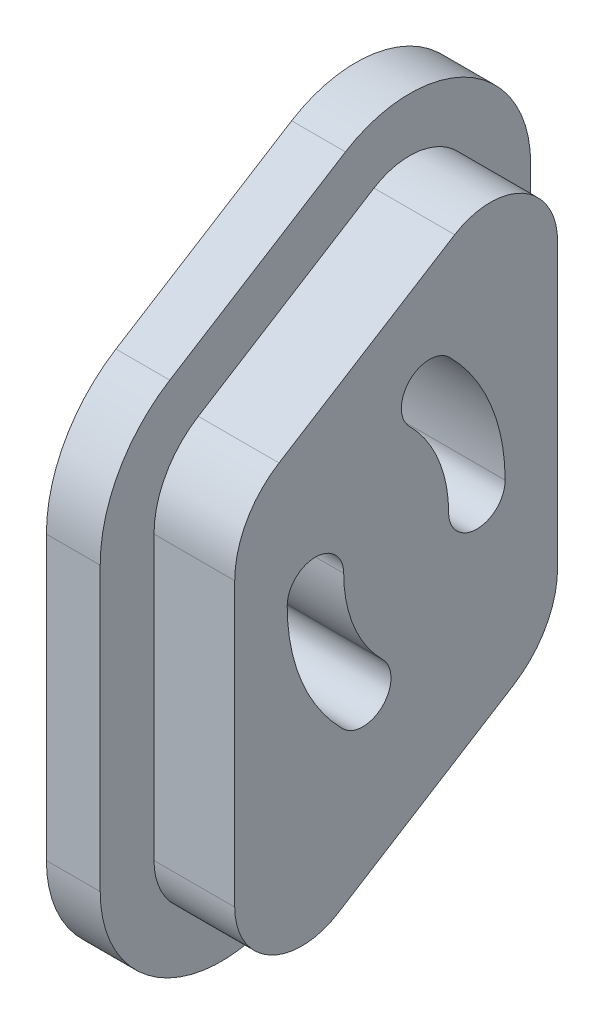
ISO-10303-21;
HEADER;
FILE_DESCRIPTION(('STEP AP214'),'2;1');
FILE_NAME('part.step','',(''),(''),'','','');
FILE_SCHEMA(('AUTOMOTIVE_DESIGN { 1 0 10303 214 1 1 1 1 }'));
ENDSEC;
DATA;
#1=APPLICATION_CONTEXT('core data for automotive mechanical design processes');
#2=APPLICATION_PROTOCOL_DEFINITION('international standard','automotive_design',2000,#1);
#3=PRODUCT_CONTEXT('',#1,'mechanical');
#4=PRODUCT('Part','Part','',(#3));
#5=PRODUCT_RELATED_PRODUCT_CATEGORY('part','',(#4));
#6=PRODUCT_DEFINITION_FORMATION('','',#4);
#7=PRODUCT_DEFINITION_CONTEXT('part definition',#1,'design');
#8=PRODUCT_DEFINITION('design','',#6,#7);
#9=PRODUCT_DEFINITION_SHAPE('','',#8);
#10=(LENGTH_UNIT() NAMED_UNIT(*) SI_UNIT(.MILLI.,.METRE.));
#11=(NAMED_UNIT(*) PLANE_ANGLE_UNIT() SI_UNIT($,.RADIAN.));
#12=(NAMED_UNIT(*) SI_UNIT($,.STERADIAN.) SOLID_ANGLE_UNIT());
#13=UNCERTAINTY_MEASURE_WITH_UNIT(LENGTH_MEASURE(1.E-05),#10,'distance_accuracy_value','');
#14=(GEOMETRIC_REPRESENTATION_CONTEXT(3) GLOBAL_UNCERTAINTY_ASSIGNED_CONTEXT((#13)) GLOBAL_UNIT_ASSIGNED_CONTEXT((#10,
#11,#12)) REPRESENTATION_CONTEXT('',''));
#15=CARTESIAN_POINT('',(0.,0.,0.));
#16=DIRECTION('',(0.,0.,1.));
#17=DIRECTION('',(1.,0.,0.));
#18=AXIS2_PLACEMENT_3D('',#15,#16,#17);
#19=CARTESIAN_POINT('',(15.,25.000000372529,17.5000002682209));
#20=DIRECTION('',(1.,0.,0.));
#21=DIRECTION('',(0.,1.,0.));
#22=AXIS2_PLACEMENT_3D('',#19,#20,#21);
#23=PLANE('',#22);
#24=CARTESIAN_POINT('',(15.,26.000000372529,20.5000003129244));
#25=DIRECTION('',(1.,0.,0.));
#26=DIRECTION('',(0.,0.,-1.));
#27=AXIS2_PLACEMENT_3D('',#24,#25,#26);
#28=CIRCLE('',#27,4.95000008940697);
#29=CARTESIAN_POINT('',(15.,26.000000372529,15.5500002235174));
#30=VERTEX_POINT('',#29);
#31=CARTESIAN_POINT('',(15.,29.5001790026227,16.9998216828307));
#32=VERTEX_POINT('',#31);
#33=EDGE_CURVE('E338',#30,#32,#28,.T.);
#34=ORIENTED_EDGE('',*,*,#33,.T.);
#35=CARTESIAN_POINT('',(15.,30.2426411228686,16.2573595625848));
#36=DIRECTION('',(-1.,0.,0.));
#37=DIRECTION('',(0.,0.707106781186548,-0.707106781186548));
#38=AXIS2_PLACEMENT_3D('',#35,#36,#37);
#39=CIRCLE('',#38,1.05);
#40=CARTESIAN_POINT('',(15.,30.9851032431145,15.514897442339));
#41=VERTEX_POINT('',#40);
#42=EDGE_CURVE('E314',#32,#41,#39,.T.);
#43=ORIENTED_EDGE('',*,*,#42,.T.);
#44=CARTESIAN_POINT('',(15.,26.000000372529,20.5000003129244));
#45=DIRECTION('',(-1.,0.,0.));
#46=DIRECTION('',(0.,0.,-1.));
#47=AXIS2_PLACEMENT_3D('',#44,#45,#46);
#48=CIRCLE('',#47,7.05000008940697);
#49=CARTESIAN_POINT('',(15.,26.000000372529,13.4500002235174));
#50=VERTEX_POINT('',#49);
#51=EDGE_CURVE('E227',#41,#50,#48,.T.);
#52=ORIENTED_EDGE('',*,*,#51,.T.);
#53=CARTESIAN_POINT('',(15.,26.000000372529,14.5000002235174));
#54=DIRECTION('',(-1.,0.,0.));
#55=DIRECTION('',(0.,0.,1.));
#56=AXIS2_PLACEMENT_3D('',#53,#54,#55);
#57=CIRCLE('',#56,1.05);
#58=EDGE_CURVE('E241',#50,#30,#57,.T.);
#59=ORIENTED_EDGE('',*,*,#58,.T.);
#60=EDGE_LOOP('',(#34,#43,#52,#59));
#61=FACE_BOUND('',#60,.T.);
#62=CARTESIAN_POINT('',(15.,26.000000372529,14.5000002235174));
#63=DIRECTION('',(1.,0.,0.));
#64=DIRECTION('',(0.,0.,1.));
#65=AXIS2_PLACEMENT_3D('',#62,#63,#64);
#66=CIRCLE('',#65,4.95000008940697);
#67=CARTESIAN_POINT('',(15.,26.000000372529,19.4500003129244));
#68=VERTEX_POINT('',#67);
#69=CARTESIAN_POINT('',(15.,22.4998217424353,18.0001788536111));
#70=VERTEX_POINT('',#69);
#71=EDGE_CURVE('E217',#68,#70,#66,.T.);
#72=ORIENTED_EDGE('',*,*,#71,.T.);
#73=CARTESIAN_POINT('',(15.,21.7573596221895,18.742640973857));
#74=DIRECTION('',(-1.,0.,0.));
#75=DIRECTION('',(0.,-0.707106781186548,0.707106781186548));
#76=AXIS2_PLACEMENT_3D('',#73,#74,#75);
#77=CIRCLE('',#76,1.05);
#78=CARTESIAN_POINT('',(15.,21.0148975019436,19.4851030941029));
#79=VERTEX_POINT('',#78);
#80=EDGE_CURVE('E262',#70,#79,#77,.T.);
#81=ORIENTED_EDGE('',*,*,#80,.T.);
#82=CARTESIAN_POINT('',(15.,26.000000372529,14.5000002235174));
#83=DIRECTION('',(-1.,0.,0.));
#84=DIRECTION('',(0.,0.,1.));
#85=AXIS2_PLACEMENT_3D('',#82,#83,#84);
#86=CIRCLE('',#85,7.05000008940697);
#87=CARTESIAN_POINT('',(15.,26.000000372529,21.5500003129244));
#88=VERTEX_POINT('',#87);
#89=EDGE_CURVE('E250',#79,#88,#86,.T.);
#90=ORIENTED_EDGE('',*,*,#89,.T.);
#91=CARTESIAN_POINT('',(15.,26.000000372529,20.5000003129244));
#92=DIRECTION('',(-1.,0.,0.));
#93=DIRECTION('',(0.,0.,-1.));
#94=AXIS2_PLACEMENT_3D('',#91,#92,#93);
#95=CIRCLE('',#94,1.05);
#96=EDGE_CURVE('E251',#88,#68,#95,.T.);
#97=ORIENTED_EDGE('',*,*,#96,.T.);
#98=EDGE_LOOP('',(#72,#81,#90,#97));
#99=FACE_BOUND('',#98,.T.);
#100=CARTESIAN_POINT('',(15.,17.2818573299295,21.0000004917383));
#101=DIRECTION('',(1.,0.,0.));
#102=DIRECTION('',(0.,0.,1.));
#103=AXIS2_PLACEMENT_3D('',#100,#101,#102);
#104=CIRCLE('',#103,2.5);
#105=CARTESIAN_POINT('',(15.,17.2818573299295,23.5000004917383));
#106=VERTEX_POINT('',#105);
#107=CARTESIAN_POINT('',(15.,15.1618615699168,19.6750031417304));
#108=VERTEX_POINT('',#107);
#109=EDGE_CURVE('E11',#106,#108,#104,.T.);
#110=ORIENTED_EDGE('',*,*,#109,.T.);
#111=DIRECTION('',(0.,0.52999894000318,-0.847998304005088));
#112=VECTOR('',#111,1.);
#113=CARTESIAN_POINT('',(15.,19.2431111868156,13.1450037546924));
#114=LINE('',#113,#112);
#115=CARTESIAN_POINT('',(15.,19.2431111868156,13.1450037546924));
#116=VERTEX_POINT('',#115);
#117=EDGE_CURVE('E242',#108,#116,#114,.T.);
#118=ORIENTED_EDGE('',*,*,#117,.T.);
#119=CARTESIAN_POINT('',(15.,22.2111052508334,15.0000000447035));
#120=DIRECTION('',(1.,0.,0.));
#121=DIRECTION('',(0.,-0.847998304005089,-0.529998940003179));
#122=AXIS2_PLACEMENT_3D('',#119,#120,#121);
#123=CIRCLE('',#122,3.5);
#124=CARTESIAN_POINT('',(15.,22.2111052508334,11.5000000447035));
#125=VERTEX_POINT('',#124);
#126=EDGE_CURVE('E206',#116,#125,#123,.T.);
#127=ORIENTED_EDGE('',*,*,#126,.T.);
#128=DIRECTION('',(0.,1.,0.));
#129=VECTOR('',#128,1.);
#130=CARTESIAN_POINT('',(15.,32.7181434151285,11.5000000447035));
#131=LINE('',#130,#129);
#132=CARTESIAN_POINT('',(15.,32.7181434151285,11.5000000447035));
#133=VERTEX_POINT('',#132);
#134=EDGE_CURVE('E254',#125,#133,#131,.T.);
#135=ORIENTED_EDGE('',*,*,#134,.T.);
#136=CARTESIAN_POINT('',(15.,32.7181434151285,14.0000000447035));
#137=DIRECTION('',(1.,0.,0.));
#138=DIRECTION('',(0.,0.,-1.));
#139=AXIS2_PLACEMENT_3D('',#136,#137,#138);
#140=CIRCLE('',#139,2.5);
#141=CARTESIAN_POINT('',(15.,34.8381391751413,15.3249973947114));
#142=VERTEX_POINT('',#141);
#143=EDGE_CURVE('E46',#133,#142,#140,.T.);
#144=ORIENTED_EDGE('',*,*,#143,.T.);
#145=DIRECTION('',(0.,-0.52999894000318,0.847998304005088));
#146=VECTOR('',#145,1.);
#147=CARTESIAN_POINT('',(15.,30.7568895582425,21.8549967817495));
#148=LINE('',#147,#146);
#149=CARTESIAN_POINT('',(15.,30.7568895582425,21.8549967817495));
#150=VERTEX_POINT('',#149);
#151=EDGE_CURVE('E263',#142,#150,#148,.T.);
#152=ORIENTED_EDGE('',*,*,#151,.T.);
#153=CARTESIAN_POINT('',(15.,27.7888954942247,20.0000004917383));
#154=DIRECTION('',(1.,0.,0.));
#155=DIRECTION('',(0.,0.847998304005088,0.52999894000318));
#156=AXIS2_PLACEMENT_3D('',#153,#154,#155);
#157=CIRCLE('',#156,3.5);
#158=CARTESIAN_POINT('',(15.,27.7888954942247,23.5000004917383));
#159=VERTEX_POINT('',#158);
#160=EDGE_CURVE('E215',#150,#159,#157,.T.);
#161=ORIENTED_EDGE('',*,*,#160,.T.);
#162=DIRECTION('',(0.,-1.,0.));
#163=VECTOR('',#162,1.);
#164=CARTESIAN_POINT('',(15.,17.2818573299295,23.5000004917383));
#165=LINE('',#164,#163);
#166=EDGE_CURVE('E216',#159,#106,#165,.T.);
#167=ORIENTED_EDGE('',*,*,#166,.T.);
#168=EDGE_LOOP('',(#110,#118,#127,#135,#144,#152,#161,#167));
#169=FACE_BOUND('',#168,.T.);
#170=ADVANCED_FACE('F42',(#61,#99,#169),#23,.T.);
#171=CARTESIAN_POINT('',(12.,17.2818573299295,21.0000004917383));
#172=DIRECTION('',(1.,0.,0.));
#173=DIRECTION('',(0.,0.,1.));
#174=AXIS2_PLACEMENT_3D('',#171,#172,#173);
#175=CYLINDRICAL_SURFACE('',#174,2.5);
#176=CARTESIAN_POINT('',(12.,17.2818573299295,21.0000004917383));
#177=DIRECTION('',(1.,0.,0.));
#178=DIRECTION('',(0.,0.,1.));
#179=AXIS2_PLACEMENT_3D('',#176,#177,#178);
#180=CIRCLE('',#179,2.5);
#181=CARTESIAN_POINT('',(12.,17.2818573299295,23.5000004917383));
#182=VERTEX_POINT('',#181);
#183=CARTESIAN_POINT('',(12.,15.1618615699168,19.6750031417304));
#184=VERTEX_POINT('',#183);
#185=EDGE_CURVE('E255',#182,#184,#180,.T.);
#186=ORIENTED_EDGE('',*,*,#185,.T.);
#187=DIRECTION('',(1.,0.,0.));
#188=VECTOR('',#187,1.);
#189=CARTESIAN_POINT('',(12.,15.1618615699168,19.6750031417304));
#190=LINE('',#189,#188);
#191=EDGE_CURVE('E52',#184,#108,#190,.T.);
#192=ORIENTED_EDGE('',*,*,#191,.T.);
#193=ORIENTED_EDGE('',*,*,#109,.F.);
#194=DIRECTION('',(1.,0.,0.));
#195=VECTOR('',#194,1.);
#196=CARTESIAN_POINT('',(12.,17.2818573299295,23.5000004917383));
#197=LINE('',#196,#195);
#198=EDGE_CURVE('E219',#182,#106,#197,.T.);
#199=ORIENTED_EDGE('',*,*,#198,.F.);
#200=EDGE_LOOP('',(#186,#192,#193,#199));
#201=FACE_BOUND('',#200,.T.);
#202=ADVANCED_FACE('F428',(#201),#175,.T.);
#203=CARTESIAN_POINT('',(12.,15.1618615699168,19.6750031417304));
#204=DIRECTION('',(0.,-0.847998304005088,-0.52999894000318));
#205=DIRECTION('',(0.,0.52999894000318,-0.847998304005088));
#206=AXIS2_PLACEMENT_3D('',#203,#204,#205);
#207=PLANE('',#206);
#208=DIRECTION('',(0.,-0.52999894000318,0.847998304005088));
#209=VECTOR('',#208,1.);
#210=CARTESIAN_POINT('',(12.,19.2431111868156,13.1450037546924));
#211=LINE('',#210,#209);
#212=CARTESIAN_POINT('',(12.,19.2431111868156,13.1450037546924));
#213=VERTEX_POINT('',#212);
#214=EDGE_CURVE('E259',#213,#184,#211,.T.);
#215=ORIENTED_EDGE('',*,*,#214,.F.);
#216=DIRECTION('',(1.,0.,0.));
#217=VECTOR('',#216,1.);
#218=CARTESIAN_POINT('',(12.,19.2431111868156,13.1450037546924));
#219=LINE('',#218,#217);
#220=EDGE_CURVE('E208',#213,#116,#219,.T.);
#221=ORIENTED_EDGE('',*,*,#220,.T.);
#222=ORIENTED_EDGE('',*,*,#117,.F.);
#223=ORIENTED_EDGE('',*,*,#191,.F.);
#224=EDGE_LOOP('',(#215,#221,#222,#223));
#225=FACE_BOUND('',#224,.T.);
#226=ADVANCED_FACE('F434',(#225),#207,.T.);
#227=CARTESIAN_POINT('',(12.,22.2111052508334,15.0000000447035));
#228=DIRECTION('',(1.,0.,0.));
#229=DIRECTION('',(0.,-0.847998304005089,-0.529998940003179));
#230=AXIS2_PLACEMENT_3D('',#227,#228,#229);
#231=CYLINDRICAL_SURFACE('',#230,3.5);
#232=CARTESIAN_POINT('',(12.,22.2111052508334,15.0000000447035));
#233=DIRECTION('',(1.,0.,0.));
#234=DIRECTION('',(0.,-0.847998304005089,-0.529998940003179));
#235=AXIS2_PLACEMENT_3D('',#232,#233,#234);
#236=CIRCLE('',#235,3.5);
#237=CARTESIAN_POINT('',(12.,22.2111052508334,11.5000000447035));
#238=VERTEX_POINT('',#237);
#239=EDGE_CURVE('E298',#213,#238,#236,.T.);
#240=ORIENTED_EDGE('',*,*,#239,.T.);
#241=DIRECTION('',(1.,0.,0.));
#242=VECTOR('',#241,1.);
#243=CARTESIAN_POINT('',(12.,22.2111052508334,11.5000000447035));
#244=LINE('',#243,#242);
#245=EDGE_CURVE('E209',#238,#125,#244,.T.);
#246=ORIENTED_EDGE('',*,*,#245,.T.);
#247=ORIENTED_EDGE('',*,*,#126,.F.);
#248=ORIENTED_EDGE('',*,*,#220,.F.);
#249=EDGE_LOOP('',(#240,#246,#247,#248));
#250=FACE_BOUND('',#249,.T.);
#251=ADVANCED_FACE('F443',(#250),#231,.T.);
#252=CARTESIAN_POINT('',(12.,22.2111052508334,11.5000000447035));
#253=DIRECTION('',(0.,0.,-1.));
#254=DIRECTION('',(0.,-1.,0.));
#255=AXIS2_PLACEMENT_3D('',#252,#253,#254);
#256=PLANE('',#255);
#257=DIRECTION('',(0.,-1.,0.));
#258=VECTOR('',#257,1.);
#259=CARTESIAN_POINT('',(12.,32.7181434151285,11.5000000447035));
#260=LINE('',#259,#258);
#261=CARTESIAN_POINT('',(12.,32.7181434151285,11.5000000447035));
#262=VERTEX_POINT('',#261);
#263=EDGE_CURVE('E301',#262,#238,#260,.T.);
#264=ORIENTED_EDGE('',*,*,#263,.F.);
#265=DIRECTION('',(1.,0.,0.));
#266=VECTOR('',#265,1.);
#267=CARTESIAN_POINT('',(12.,32.7181434151285,11.5000000447035));
#268=LINE('',#267,#266);
#269=EDGE_CURVE('E273',#262,#133,#268,.T.);
#270=ORIENTED_EDGE('',*,*,#269,.T.);
#271=ORIENTED_EDGE('',*,*,#134,.F.);
#272=ORIENTED_EDGE('',*,*,#245,.F.);
#273=EDGE_LOOP('',(#264,#270,#271,#272));
#274=FACE_BOUND('',#273,.T.);
#275=ADVANCED_FACE('F495',(#274),#256,.T.);
#276=CARTESIAN_POINT('',(12.,32.7181434151285,14.0000000447035));
#277=DIRECTION('',(1.,0.,0.));
#278=DIRECTION('',(0.,0.,-1.));
#279=AXIS2_PLACEMENT_3D('',#276,#277,#278);
#280=CYLINDRICAL_SURFACE('',#279,2.5);
#281=CARTESIAN_POINT('',(12.,32.7181434151285,14.0000000447035));
#282=DIRECTION('',(1.,0.,0.));
#283=DIRECTION('',(0.,0.,-1.));
#284=AXIS2_PLACEMENT_3D('',#281,#282,#283);
#285=CIRCLE('',#284,2.5);
#286=CARTESIAN_POINT('',(12.,34.8381391751413,15.3249973947114));
#287=VERTEX_POINT('',#286);
#288=EDGE_CURVE('E323',#262,#287,#285,.T.);
#289=ORIENTED_EDGE('',*,*,#288,.T.);
#290=DIRECTION('',(1.,0.,0.));
#291=VECTOR('',#290,1.);
#292=CARTESIAN_POINT('',(12.,34.8381391751413,15.3249973947114));
#293=LINE('',#292,#291);
#294=EDGE_CURVE('E266',#287,#142,#293,.T.);
#295=ORIENTED_EDGE('',*,*,#294,.T.);
#296=ORIENTED_EDGE('',*,*,#143,.F.);
#297=ORIENTED_EDGE('',*,*,#269,.F.);
#298=EDGE_LOOP('',(#289,#295,#296,#297));
#299=FACE_BOUND('',#298,.T.);
#300=ADVANCED_FACE('F482',(#299),#280,.T.);
#301=CARTESIAN_POINT('',(12.,34.8381391751413,15.3249973947114));
#302=DIRECTION('',(0.,0.847998304005088,0.52999894000318));
#303=DIRECTION('',(1.,0.,0.));
#304=AXIS2_PLACEMENT_3D('',#301,#302,#303);
#305=PLANE('',#304);
#306=DIRECTION('',(0.,0.52999894000318,-0.847998304005088));
#307=VECTOR('',#306,1.);
#308=CARTESIAN_POINT('',(12.,30.7568895582425,21.8549967817495));
#309=LINE('',#308,#307);
#310=CARTESIAN_POINT('',(12.,30.7568895582425,21.8549967817495));
#311=VERTEX_POINT('',#310);
#312=EDGE_CURVE('E321',#311,#287,#309,.T.);
#313=ORIENTED_EDGE('',*,*,#312,.F.);
#314=DIRECTION('',(1.,0.,0.));
#315=VECTOR('',#314,1.);
#316=CARTESIAN_POINT('',(12.,30.7568895582425,21.8549967817495));
#317=LINE('',#316,#315);
#318=EDGE_CURVE('E226',#311,#150,#317,.T.);
#319=ORIENTED_EDGE('',*,*,#318,.T.);
#320=ORIENTED_EDGE('',*,*,#151,.F.);
#321=ORIENTED_EDGE('',*,*,#294,.F.);
#322=EDGE_LOOP('',(#313,#319,#320,#321));
#323=FACE_BOUND('',#322,.T.);
#324=ADVANCED_FACE('F473',(#323),#305,.T.);
#325=CARTESIAN_POINT('',(12.,27.7888954942247,20.0000004917383));
#326=DIRECTION('',(1.,0.,0.));
#327=DIRECTION('',(0.,0.847998304005088,0.52999894000318));
#328=AXIS2_PLACEMENT_3D('',#325,#326,#327);
#329=CYLINDRICAL_SURFACE('',#328,3.5);
#330=CARTESIAN_POINT('',(12.,27.7888954942247,20.0000004917383));
#331=DIRECTION('',(1.,0.,0.));
#332=DIRECTION('',(0.,0.847998304005088,0.52999894000318));
#333=AXIS2_PLACEMENT_3D('',#330,#331,#332);
#334=CIRCLE('',#333,3.5);
#335=CARTESIAN_POINT('',(12.,27.7888954942247,23.5000004917383));
#336=VERTEX_POINT('',#335);
#337=EDGE_CURVE('E324',#311,#336,#334,.T.);
#338=ORIENTED_EDGE('',*,*,#337,.T.);
#339=DIRECTION('',(1.,0.,0.));
#340=VECTOR('',#339,1.);
#341=CARTESIAN_POINT('',(12.,27.7888954942247,23.5000004917383));
#342=LINE('',#341,#340);
#343=EDGE_CURVE('E212',#336,#159,#342,.T.);
#344=ORIENTED_EDGE('',*,*,#343,.T.);
#345=ORIENTED_EDGE('',*,*,#160,.F.);
#346=ORIENTED_EDGE('',*,*,#318,.F.);
#347=EDGE_LOOP('',(#338,#344,#345,#346));
#348=FACE_BOUND('',#347,.T.);
#349=ADVANCED_FACE('F470',(#348),#329,.T.);
#350=CARTESIAN_POINT('',(12.,27.7888954942247,23.5000004917383));
#351=DIRECTION('',(0.,0.,1.));
#352=DIRECTION('',(1.,0.,0.));
#353=AXIS2_PLACEMENT_3D('',#350,#351,#352);
#354=PLANE('',#353);
#355=DIRECTION('',(0.,1.,0.));
#356=VECTOR('',#355,1.);
#357=CARTESIAN_POINT('',(12.,17.2818573299295,23.5000004917383));
#358=LINE('',#357,#356);
#359=EDGE_CURVE('E333',#182,#336,#358,.T.);
#360=ORIENTED_EDGE('',*,*,#359,.F.);
#361=ORIENTED_EDGE('',*,*,#198,.T.);
#362=ORIENTED_EDGE('',*,*,#166,.F.);
#363=ORIENTED_EDGE('',*,*,#343,.F.);
#364=EDGE_LOOP('',(#360,#361,#362,#363));
#365=FACE_BOUND('',#364,.T.);
#366=ADVANCED_FACE('F449',(#365),#354,.T.);
#367=CARTESIAN_POINT('',(12.,26.000000372529,14.5000002235174));
#368=DIRECTION('',(1.,0.,0.));
#369=DIRECTION('',(0.,0.,1.));
#370=AXIS2_PLACEMENT_3D('',#367,#368,#369);
#371=CYLINDRICAL_SURFACE('',#370,4.95000008940697);
#372=DIRECTION('',(1.,0.,0.));
#373=VECTOR('',#372,1.);
#374=CARTESIAN_POINT('',(12.,22.4998217424353,18.0001788536111));
#375=LINE('',#374,#373);
#376=CARTESIAN_POINT('',(10.,22.4998217424353,18.0001788536111));
#377=VERTEX_POINT('',#376);
#378=EDGE_CURVE('E220',#377,#70,#375,.T.);
#379=ORIENTED_EDGE('',*,*,#378,.T.);
#380=ORIENTED_EDGE('',*,*,#71,.F.);
#381=DIRECTION('',(-1.,0.,0.));
#382=VECTOR('',#381,1.);
#383=CARTESIAN_POINT('',(12.,26.000000372529,19.4500003129244));
#384=LINE('',#383,#382);
#385=CARTESIAN_POINT('',(10.,26.000000372529,19.4500003129244));
#386=VERTEX_POINT('',#385);
#387=EDGE_CURVE('E204',#68,#386,#384,.T.);
#388=ORIENTED_EDGE('',*,*,#387,.T.);
#389=CARTESIAN_POINT('',(10.,26.000000372529,14.5000002235174));
#390=DIRECTION('',(-1.,0.,0.));
#391=DIRECTION('',(0.,0.,1.));
#392=AXIS2_PLACEMENT_3D('',#389,#390,#391);
#393=CIRCLE('',#392,4.95000008940697);
#394=EDGE_CURVE('E306',#377,#386,#393,.T.);
#395=ORIENTED_EDGE('',*,*,#394,.F.);
#396=EDGE_LOOP('',(#379,#380,#388,#395));
#397=FACE_BOUND('',#396,.T.);
#398=ADVANCED_FACE('F418',(#397),#371,.T.);
#399=CARTESIAN_POINT('',(12.,21.7573596221895,18.742640973857));
#400=DIRECTION('',(1.,0.,0.));
#401=DIRECTION('',(0.,-0.707106781186548,0.707106781186548));
#402=AXIS2_PLACEMENT_3D('',#399,#400,#401);
#403=CYLINDRICAL_SURFACE('',#402,1.05);
#404=DIRECTION('',(1.,0.,0.));
#405=VECTOR('',#404,1.);
#406=CARTESIAN_POINT('',(12.,21.0148975019436,19.4851030941029));
#407=LINE('',#406,#405);
#408=CARTESIAN_POINT('',(10.,21.0148975019436,19.4851030941029));
#409=VERTEX_POINT('',#408);
#410=EDGE_CURVE('E282',#409,#79,#407,.T.);
#411=ORIENTED_EDGE('',*,*,#410,.T.);
#412=ORIENTED_EDGE('',*,*,#80,.F.);
#413=ORIENTED_EDGE('',*,*,#378,.F.);
#414=CARTESIAN_POINT('',(10.,21.7573596221895,18.742640973857));
#415=DIRECTION('',(1.,0.,0.));
#416=DIRECTION('',(0.,-0.707106781186548,0.707106781186548));
#417=AXIS2_PLACEMENT_3D('',#414,#415,#416);
#418=CIRCLE('',#417,1.05);
#419=EDGE_CURVE('E348',#409,#377,#418,.T.);
#420=ORIENTED_EDGE('',*,*,#419,.F.);
#421=EDGE_LOOP('',(#411,#412,#413,#420));
#422=FACE_BOUND('',#421,.T.);
#423=ADVANCED_FACE('F412',(#422),#403,.F.);
#424=CARTESIAN_POINT('',(12.,26.000000372529,14.5000002235174));
#425=DIRECTION('',(1.,0.,0.));
#426=DIRECTION('',(0.,0.,1.));
#427=AXIS2_PLACEMENT_3D('',#424,#425,#426);
#428=CYLINDRICAL_SURFACE('',#427,7.05000008940697);
#429=DIRECTION('',(1.,0.,0.));
#430=VECTOR('',#429,1.);
#431=CARTESIAN_POINT('',(12.,26.000000372529,21.5500003129244));
#432=LINE('',#431,#430);
#433=CARTESIAN_POINT('',(10.,26.000000372529,21.5500003129244));
#434=VERTEX_POINT('',#433);
#435=EDGE_CURVE('E247',#434,#88,#432,.T.);
#436=ORIENTED_EDGE('',*,*,#435,.T.);
#437=ORIENTED_EDGE('',*,*,#89,.F.);
#438=ORIENTED_EDGE('',*,*,#410,.F.);
#439=CARTESIAN_POINT('',(10.,26.000000372529,14.5000002235174));
#440=DIRECTION('',(1.,0.,0.));
#441=DIRECTION('',(0.,0.,1.));
#442=AXIS2_PLACEMENT_3D('',#439,#440,#441);
#443=CIRCLE('',#442,7.05000008940697);
#444=EDGE_CURVE('E305',#434,#409,#443,.T.);
#445=ORIENTED_EDGE('',*,*,#444,.F.);
#446=EDGE_LOOP('',(#436,#437,#438,#445));
#447=FACE_BOUND('',#446,.T.);
#448=ADVANCED_FACE('F425',(#447),#428,.F.);
#449=CARTESIAN_POINT('',(12.,26.000000372529,20.5000003129244));
#450=DIRECTION('',(1.,0.,0.));
#451=DIRECTION('',(0.,0.,-1.));
#452=AXIS2_PLACEMENT_3D('',#449,#450,#451);
#453=CYLINDRICAL_SURFACE('',#452,1.05);
#454=ORIENTED_EDGE('',*,*,#387,.F.);
#455=ORIENTED_EDGE('',*,*,#96,.F.);
#456=ORIENTED_EDGE('',*,*,#435,.F.);
#457=CARTESIAN_POINT('',(10.,26.000000372529,20.5000003129244));
#458=DIRECTION('',(1.,0.,0.));
#459=DIRECTION('',(0.,0.,-1.));
#460=AXIS2_PLACEMENT_3D('',#457,#458,#459);
#461=CIRCLE('',#460,1.05);
#462=EDGE_CURVE('E302',#386,#434,#461,.T.);
#463=ORIENTED_EDGE('',*,*,#462,.F.);
#464=EDGE_LOOP('',(#454,#455,#456,#463));
#465=FACE_BOUND('',#464,.T.);
#466=ADVANCED_FACE('F44',(#465),#453,.F.);
#467=CARTESIAN_POINT('',(12.,26.000000372529,20.5000003129244));
#468=DIRECTION('',(1.,0.,0.));
#469=DIRECTION('',(0.,0.,-1.));
#470=AXIS2_PLACEMENT_3D('',#467,#468,#469);
#471=CYLINDRICAL_SURFACE('',#470,4.95000008940697);
#472=DIRECTION('',(1.,0.,0.));
#473=VECTOR('',#472,1.);
#474=CARTESIAN_POINT('',(12.,29.5001790026227,16.9998216828307));
#475=LINE('',#474,#473);
#476=CARTESIAN_POINT('',(10.,29.5001790026227,16.9998216828307));
#477=VERTEX_POINT('',#476);
#478=EDGE_CURVE('E316',#477,#32,#475,.T.);
#479=ORIENTED_EDGE('',*,*,#478,.T.);
#480=ORIENTED_EDGE('',*,*,#33,.F.);
#481=DIRECTION('',(-1.,0.,0.));
#482=VECTOR('',#481,1.);
#483=CARTESIAN_POINT('',(12.,26.000000372529,15.5500002235174));
#484=LINE('',#483,#482);
#485=CARTESIAN_POINT('',(10.,26.000000372529,15.5500002235174));
#486=VERTEX_POINT('',#485);
#487=EDGE_CURVE('E328',#30,#486,#484,.T.);
#488=ORIENTED_EDGE('',*,*,#487,.T.);
#489=CARTESIAN_POINT('',(10.,26.000000372529,20.5000003129244));
#490=DIRECTION('',(-1.,0.,0.));
#491=DIRECTION('',(0.,0.,-1.));
#492=AXIS2_PLACEMENT_3D('',#489,#490,#491);
#493=CIRCLE('',#492,4.95000008940697);
#494=EDGE_CURVE('E288',#477,#486,#493,.T.);
#495=ORIENTED_EDGE('',*,*,#494,.F.);
#496=EDGE_LOOP('',(#479,#480,#488,#495));
#497=FACE_BOUND('',#496,.T.);
#498=ADVANCED_FACE('F488',(#497),#471,.T.);
#499=CARTESIAN_POINT('',(12.,30.2426411228686,16.2573595625848));
#500=DIRECTION('',(1.,0.,0.));
#501=DIRECTION('',(0.,0.707106781186548,-0.707106781186548));
#502=AXIS2_PLACEMENT_3D('',#499,#500,#501);
#503=CYLINDRICAL_SURFACE('',#502,1.05);
#504=DIRECTION('',(1.,0.,0.));
#505=VECTOR('',#504,1.);
#506=CARTESIAN_POINT('',(12.,30.9851032431145,15.514897442339));
#507=LINE('',#506,#505);
#508=CARTESIAN_POINT('',(10.,30.9851032431145,15.514897442339));
#509=VERTEX_POINT('',#508);
#510=EDGE_CURVE('E230',#509,#41,#507,.T.);
#511=ORIENTED_EDGE('',*,*,#510,.T.);
#512=ORIENTED_EDGE('',*,*,#42,.F.);
#513=ORIENTED_EDGE('',*,*,#478,.F.);
#514=CARTESIAN_POINT('',(10.,30.2426411228686,16.2573595625848));
#515=DIRECTION('',(1.,0.,0.));
#516=DIRECTION('',(0.,0.707106781186548,-0.707106781186548));
#517=AXIS2_PLACEMENT_3D('',#514,#515,#516);
#518=CIRCLE('',#517,1.05);
#519=EDGE_CURVE('E278',#509,#477,#518,.T.);
#520=ORIENTED_EDGE('',*,*,#519,.F.);
#521=EDGE_LOOP('',(#511,#512,#513,#520));
#522=FACE_BOUND('',#521,.T.);
#523=ADVANCED_FACE('F486',(#522),#503,.F.);
#524=CARTESIAN_POINT('',(12.,26.000000372529,20.5000003129244));
#525=DIRECTION('',(1.,0.,0.));
#526=DIRECTION('',(0.,0.,-1.));
#527=AXIS2_PLACEMENT_3D('',#524,#525,#526);
#528=CYLINDRICAL_SURFACE('',#527,7.05000008940697);
#529=DIRECTION('',(1.,0.,0.));
#530=VECTOR('',#529,1.);
#531=CARTESIAN_POINT('',(12.,26.000000372529,13.4500002235174));
#532=LINE('',#531,#530);
#533=CARTESIAN_POINT('',(10.,26.000000372529,13.4500002235174));
#534=VERTEX_POINT('',#533);
#535=EDGE_CURVE('E231',#534,#50,#532,.T.);
#536=ORIENTED_EDGE('',*,*,#535,.T.);
#537=ORIENTED_EDGE('',*,*,#51,.F.);
#538=ORIENTED_EDGE('',*,*,#510,.F.);
#539=CARTESIAN_POINT('',(10.,26.000000372529,20.5000003129244));
#540=DIRECTION('',(1.,0.,0.));
#541=DIRECTION('',(0.,0.,-1.));
#542=AXIS2_PLACEMENT_3D('',#539,#540,#541);
#543=CIRCLE('',#542,7.05000008940697);
#544=EDGE_CURVE('E275',#534,#509,#543,.T.);
#545=ORIENTED_EDGE('',*,*,#544,.F.);
#546=EDGE_LOOP('',(#536,#537,#538,#545));
#547=FACE_BOUND('',#546,.T.);
#548=ADVANCED_FACE('F454',(#547),#528,.F.);
#549=CARTESIAN_POINT('',(12.,26.000000372529,14.5000002235174));
#550=DIRECTION('',(1.,0.,0.));
#551=DIRECTION('',(0.,0.,1.));
#552=AXIS2_PLACEMENT_3D('',#549,#550,#551);
#553=CYLINDRICAL_SURFACE('',#552,1.05);
#554=ORIENTED_EDGE('',*,*,#487,.F.);
#555=ORIENTED_EDGE('',*,*,#58,.F.);
#556=ORIENTED_EDGE('',*,*,#535,.F.);
#557=CARTESIAN_POINT('',(10.,26.000000372529,14.5000002235174));
#558=DIRECTION('',(1.,0.,0.));
#559=DIRECTION('',(0.,0.,1.));
#560=AXIS2_PLACEMENT_3D('',#557,#558,#559);
#561=CIRCLE('',#560,1.05);
#562=EDGE_CURVE('E279',#486,#534,#561,.T.);
#563=ORIENTED_EDGE('',*,*,#562,.F.);
#564=EDGE_LOOP('',(#554,#555,#556,#563));
#565=FACE_BOUND('',#564,.T.);
#566=ADVANCED_FACE('F452',(#565),#553,.F.);
#567=CARTESIAN_POINT('',(10.,25.000000372529,17.5000002682209));
#568=DIRECTION('',(1.,0.,0.));
#569=DIRECTION('',(0.,1.,0.));
#570=AXIS2_PLACEMENT_3D('',#567,#568,#569);
#571=PLANE('',#570);
#572=ORIENTED_EDGE('',*,*,#394,.T.);
#573=ORIENTED_EDGE('',*,*,#462,.T.);
#574=ORIENTED_EDGE('',*,*,#444,.T.);
#575=ORIENTED_EDGE('',*,*,#419,.T.);
#576=EDGE_LOOP('',(#572,#573,#574,#575));
#577=FACE_BOUND('',#576,.T.);
#578=ORIENTED_EDGE('',*,*,#494,.T.);
#579=ORIENTED_EDGE('',*,*,#562,.T.);
#580=ORIENTED_EDGE('',*,*,#544,.T.);
#581=ORIENTED_EDGE('',*,*,#519,.T.);
#582=EDGE_LOOP('',(#578,#579,#580,#581));
#583=FACE_BOUND('',#582,.T.);
#584=CARTESIAN_POINT('',(10.,17.2818573299295,21.0000004917383));
#585=DIRECTION('',(-1.,0.,0.));
#586=DIRECTION('',(0.,0.,1.));
#587=AXIS2_PLACEMENT_3D('',#584,#585,#586);
#588=CIRCLE('',#587,4.5);
#589=CARTESIAN_POINT('',(10.,13.4658649619066,18.615005261724));
#590=VERTEX_POINT('',#589);
#591=CARTESIAN_POINT('',(10.,17.2818573299295,25.5000004917383));
#592=VERTEX_POINT('',#591);
#593=EDGE_CURVE('E291',#590,#592,#588,.T.);
#594=ORIENTED_EDGE('',*,*,#593,.T.);
#595=DIRECTION('',(0.,1.,0.));
#596=VECTOR('',#595,1.);
#597=CARTESIAN_POINT('',(10.,17.2818573299295,25.5000004917383));
#598=LINE('',#597,#596);
#599=CARTESIAN_POINT('',(10.,27.7888954942247,25.5000004917383));
#600=VERTEX_POINT('',#599);
#601=EDGE_CURVE('E267',#592,#600,#598,.T.);
#602=ORIENTED_EDGE('',*,*,#601,.T.);
#603=CARTESIAN_POINT('',(10.,27.7888954942247,20.0000004917383));
#604=DIRECTION('',(-1.,0.,0.));
#605=DIRECTION('',(0.,0.847998304005088,0.52999894000318));
#606=AXIS2_PLACEMENT_3D('',#603,#604,#605);
#607=CIRCLE('',#606,5.5);
#608=CARTESIAN_POINT('',(10.,32.4528861662527,22.9149946617558));
#609=VERTEX_POINT('',#608);
#610=EDGE_CURVE('E182',#600,#609,#607,.T.);
#611=ORIENTED_EDGE('',*,*,#610,.T.);
#612=DIRECTION('',(0.,0.52999894000318,-0.847998304005088));
#613=VECTOR('',#612,1.);
#614=CARTESIAN_POINT('',(10.,32.4528861662527,22.9149946617558));
#615=LINE('',#614,#613);
#616=CARTESIAN_POINT('',(10.,36.5341357831514,16.3849952747178));
#617=VERTEX_POINT('',#616);
#618=EDGE_CURVE('E174',#609,#617,#615,.T.);
#619=ORIENTED_EDGE('',*,*,#618,.T.);
#620=CARTESIAN_POINT('',(10.,32.7181434151285,14.0000000447035));
#621=DIRECTION('',(-1.,0.,0.));
#622=DIRECTION('',(0.,0.,-1.));
#623=AXIS2_PLACEMENT_3D('',#620,#621,#622);
#624=CIRCLE('',#623,4.5);
#625=CARTESIAN_POINT('',(10.,32.7181434151285,9.50000004470348));
#626=VERTEX_POINT('',#625);
#627=EDGE_CURVE('E179',#617,#626,#624,.T.);
#628=ORIENTED_EDGE('',*,*,#627,.T.);
#629=DIRECTION('',(0.,-1.,0.));
#630=VECTOR('',#629,1.);
#631=CARTESIAN_POINT('',(10.,32.7181434151285,9.50000004470348));
#632=LINE('',#631,#630);
#633=CARTESIAN_POINT('',(10.,22.2111052508334,9.50000004470349));
#634=VERTEX_POINT('',#633);
#635=EDGE_CURVE('E200',#626,#634,#632,.T.);
#636=ORIENTED_EDGE('',*,*,#635,.T.);
#637=CARTESIAN_POINT('',(10.,22.2111052508334,15.0000000447035));
#638=DIRECTION('',(-1.,0.,0.));
#639=DIRECTION('',(0.,-0.847998304005087,-0.529998940003181));
#640=AXIS2_PLACEMENT_3D('',#637,#638,#639);
#641=CIRCLE('',#640,5.5);
#642=CARTESIAN_POINT('',(10.,17.5471145788054,12.085005874686));
#643=VERTEX_POINT('',#642);
#644=EDGE_CURVE('E221',#634,#643,#641,.T.);
#645=ORIENTED_EDGE('',*,*,#644,.T.);
#646=DIRECTION('',(0.,-0.52999894000318,0.847998304005088));
#647=VECTOR('',#646,1.);
#648=CARTESIAN_POINT('',(10.,17.5471145788054,12.085005874686));
#649=LINE('',#648,#647);
#650=EDGE_CURVE('E287',#643,#590,#649,.T.);
#651=ORIENTED_EDGE('',*,*,#650,.T.);
#652=EDGE_LOOP('',(#594,#602,#611,#619,#628,#636,#645,#651));
#653=FACE_BOUND('',#652,.T.);
#654=ADVANCED_FACE('F177',(#577,#583,#653),#571,.F.);
#655=CARTESIAN_POINT('',(12.,17.2818573299295,21.0000004917383));
#656=DIRECTION('',(-1.,0.,0.));
#657=DIRECTION('',(0.,0.,1.));
#658=AXIS2_PLACEMENT_3D('',#655,#656,#657);
#659=CYLINDRICAL_SURFACE('',#658,4.5);
#660=CARTESIAN_POINT('',(12.,17.2818573299295,21.0000004917383));
#661=DIRECTION('',(1.,0.,0.));
#662=DIRECTION('',(0.,0.,1.));
#663=AXIS2_PLACEMENT_3D('',#660,#661,#662);
#664=CIRCLE('',#663,4.5);
#665=CARTESIAN_POINT('',(12.,17.2818573299295,25.5000004917383));
#666=VERTEX_POINT('',#665);
#667=CARTESIAN_POINT('',(12.,13.4658649619066,18.615005261724));
#668=VERTEX_POINT('',#667);
#669=EDGE_CURVE('E232',#666,#668,#664,.T.);
#670=ORIENTED_EDGE('',*,*,#669,.F.);
#671=DIRECTION('',(-1.,0.,0.));
#672=VECTOR('',#671,1.);
#673=CARTESIAN_POINT('',(12.,17.2818573299295,25.5000004917383));
#674=LINE('',#673,#672);
#675=EDGE_CURVE('E269',#666,#592,#674,.T.);
#676=ORIENTED_EDGE('',*,*,#675,.T.);
#677=ORIENTED_EDGE('',*,*,#593,.F.);
#678=DIRECTION('',(-1.,0.,0.));
#679=VECTOR('',#678,1.);
#680=CARTESIAN_POINT('',(12.,13.4658649619066,18.615005261724));
#681=LINE('',#680,#679);
#682=EDGE_CURVE('E258',#668,#590,#681,.T.);
#683=ORIENTED_EDGE('',*,*,#682,.F.);
#684=EDGE_LOOP('',(#670,#676,#677,#683));
#685=FACE_BOUND('',#684,.T.);
#686=ADVANCED_FACE('F439',(#685),#659,.T.);
#687=CARTESIAN_POINT('',(12.,17.2818573299295,25.5000004917383));
#688=DIRECTION('',(0.,0.,1.));
#689=DIRECTION('',(1.,0.,0.));
#690=AXIS2_PLACEMENT_3D('',#687,#688,#689);
#691=PLANE('',#690);
#692=DIRECTION('',(0.,1.,0.));
#693=VECTOR('',#692,1.);
#694=CARTESIAN_POINT('',(12.,17.2818573299295,25.5000004917383));
#695=LINE('',#694,#693);
#696=CARTESIAN_POINT('',(12.,27.7888954942247,25.5000004917383));
#697=VERTEX_POINT('',#696);
#698=EDGE_CURVE('E313',#666,#697,#695,.T.);
#699=ORIENTED_EDGE('',*,*,#698,.T.);
#700=DIRECTION('',(-1.,0.,0.));
#701=VECTOR('',#700,1.);
#702=CARTESIAN_POINT('',(12.,27.7888954942247,25.5000004917383));
#703=LINE('',#702,#701);
#704=EDGE_CURVE('E211',#697,#600,#703,.T.);
#705=ORIENTED_EDGE('',*,*,#704,.T.);
#706=ORIENTED_EDGE('',*,*,#601,.F.);
#707=ORIENTED_EDGE('',*,*,#675,.F.);
#708=EDGE_LOOP('',(#699,#705,#706,#707));
#709=FACE_BOUND('',#708,.T.);
#710=ADVANCED_FACE('F461',(#709),#691,.T.);
#711=CARTESIAN_POINT('',(12.,27.7888954942247,20.0000004917383));
#712=DIRECTION('',(-1.,0.,0.));
#713=DIRECTION('',(0.,0.847998304005088,0.52999894000318));
#714=AXIS2_PLACEMENT_3D('',#711,#712,#713);
#715=CYLINDRICAL_SURFACE('',#714,5.5);
#716=CARTESIAN_POINT('',(12.,27.7888954942247,20.0000004917383));
#717=DIRECTION('',(1.,0.,0.));
#718=DIRECTION('',(0.,0.847998304005088,0.52999894000318));
#719=AXIS2_PLACEMENT_3D('',#716,#717,#718);
#720=CIRCLE('',#719,5.5);
#721=CARTESIAN_POINT('',(12.,32.4528861662527,22.9149946617558));
#722=VERTEX_POINT('',#721);
#723=EDGE_CURVE('E293',#722,#697,#720,.T.);
#724=ORIENTED_EDGE('',*,*,#723,.F.);
#725=DIRECTION('',(-1.,0.,0.));
#726=VECTOR('',#725,1.);
#727=CARTESIAN_POINT('',(12.,32.4528861662527,22.9149946617558));
#728=LINE('',#727,#726);
#729=EDGE_CURVE('E185',#722,#609,#728,.T.);
#730=ORIENTED_EDGE('',*,*,#729,.T.);
#731=ORIENTED_EDGE('',*,*,#610,.F.);
#732=ORIENTED_EDGE('',*,*,#704,.F.);
#733=EDGE_LOOP('',(#724,#730,#731,#732));
#734=FACE_BOUND('',#733,.T.);
#735=ADVANCED_FACE('F457',(#734),#715,.T.);
#736=CARTESIAN_POINT('',(12.,32.4528861662527,22.9149946617558));
#737=DIRECTION('',(0.,0.847998304005088,0.52999894000318));
#738=DIRECTION('',(1.,0.,0.));
#739=AXIS2_PLACEMENT_3D('',#736,#737,#738);
#740=PLANE('',#739);
#741=DIRECTION('',(0.,0.52999894000318,-0.847998304005088));
#742=VECTOR('',#741,1.);
#743=CARTESIAN_POINT('',(12.,32.4528861662527,22.9149946617558));
#744=LINE('',#743,#742);
#745=CARTESIAN_POINT('',(12.,36.5341357831514,16.3849952747178));
#746=VERTEX_POINT('',#745);
#747=EDGE_CURVE('E191',#722,#746,#744,.T.);
#748=ORIENTED_EDGE('',*,*,#747,.T.);
#749=DIRECTION('',(-1.,0.,0.));
#750=VECTOR('',#749,1.);
#751=CARTESIAN_POINT('',(12.,36.5341357831514,16.3849952747178));
#752=LINE('',#751,#750);
#753=EDGE_CURVE('E186',#746,#617,#752,.T.);
#754=ORIENTED_EDGE('',*,*,#753,.T.);
#755=ORIENTED_EDGE('',*,*,#618,.F.);
#756=ORIENTED_EDGE('',*,*,#729,.F.);
#757=EDGE_LOOP('',(#748,#754,#755,#756));
#758=FACE_BOUND('',#757,.T.);
#759=ADVANCED_FACE('F189',(#758),#740,.T.);
#760=CARTESIAN_POINT('',(12.,32.7181434151285,14.0000000447035));
#761=DIRECTION('',(-1.,0.,0.));
#762=DIRECTION('',(0.,0.,-1.));
#763=AXIS2_PLACEMENT_3D('',#760,#761,#762);
#764=CYLINDRICAL_SURFACE('',#763,4.5);
#765=CARTESIAN_POINT('',(12.,32.7181434151285,14.0000000447035));
#766=DIRECTION('',(1.,0.,0.));
#767=DIRECTION('',(0.,0.,-1.));
#768=AXIS2_PLACEMENT_3D('',#765,#766,#767);
#769=CIRCLE('',#768,4.5);
#770=CARTESIAN_POINT('',(12.,32.7181434151285,9.50000004470348));
#771=VERTEX_POINT('',#770);
#772=EDGE_CURVE('E236',#771,#746,#769,.T.);
#773=ORIENTED_EDGE('',*,*,#772,.F.);
#774=DIRECTION('',(-1.,0.,0.));
#775=VECTOR('',#774,1.);
#776=CARTESIAN_POINT('',(12.,32.7181434151285,9.50000004470348));
#777=LINE('',#776,#775);
#778=EDGE_CURVE('E197',#771,#626,#777,.T.);
#779=ORIENTED_EDGE('',*,*,#778,.T.);
#780=ORIENTED_EDGE('',*,*,#627,.F.);
#781=ORIENTED_EDGE('',*,*,#753,.F.);
#782=EDGE_LOOP('',(#773,#779,#780,#781));
#783=FACE_BOUND('',#782,.T.);
#784=ADVANCED_FACE('F196',(#783),#764,.T.);
#785=CARTESIAN_POINT('',(12.,32.7181434151285,9.50000004470348));
#786=DIRECTION('',(0.,0.,-1.));
#787=DIRECTION('',(0.,-1.,0.));
#788=AXIS2_PLACEMENT_3D('',#785,#786,#787);
#789=PLANE('',#788);
#790=DIRECTION('',(0.,-1.,0.));
#791=VECTOR('',#790,1.);
#792=CARTESIAN_POINT('',(12.,32.7181434151285,9.50000004470348));
#793=LINE('',#792,#791);
#794=CARTESIAN_POINT('',(12.,22.2111052508334,9.50000004470349));
#795=VERTEX_POINT('',#794);
#796=EDGE_CURVE('E238',#771,#795,#793,.T.);
#797=ORIENTED_EDGE('',*,*,#796,.T.);
#798=DIRECTION('',(-1.,0.,0.));
#799=VECTOR('',#798,1.);
#800=CARTESIAN_POINT('',(12.,22.2111052508334,9.50000004470349));
#801=LINE('',#800,#799);
#802=EDGE_CURVE('E222',#795,#634,#801,.T.);
#803=ORIENTED_EDGE('',*,*,#802,.T.);
#804=ORIENTED_EDGE('',*,*,#635,.F.);
#805=ORIENTED_EDGE('',*,*,#778,.F.);
#806=EDGE_LOOP('',(#797,#803,#804,#805));
#807=FACE_BOUND('',#806,.T.);
#808=ADVANCED_FACE('F383',(#807),#789,.T.);
#809=CARTESIAN_POINT('',(12.,22.2111052508334,15.0000000447035));
#810=DIRECTION('',(-1.,0.,0.));
#811=DIRECTION('',(0.,-0.847998304005087,-0.529998940003181));
#812=AXIS2_PLACEMENT_3D('',#809,#810,#811);
#813=CYLINDRICAL_SURFACE('',#812,5.5);
#814=CARTESIAN_POINT('',(12.,22.2111052508334,15.0000000447035));
#815=DIRECTION('',(1.,0.,0.));
#816=DIRECTION('',(0.,-0.847998304005087,-0.529998940003181));
#817=AXIS2_PLACEMENT_3D('',#814,#815,#816);
#818=CIRCLE('',#817,5.5);
#819=CARTESIAN_POINT('',(12.,17.5471145788054,12.085005874686));
#820=VERTEX_POINT('',#819);
#821=EDGE_CURVE('E246',#820,#795,#818,.T.);
#822=ORIENTED_EDGE('',*,*,#821,.F.);
#823=DIRECTION('',(-1.,0.,0.));
#824=VECTOR('',#823,1.);
#825=CARTESIAN_POINT('',(12.,17.5471145788054,12.085005874686));
#826=LINE('',#825,#824);
#827=EDGE_CURVE('E223',#820,#643,#826,.T.);
#828=ORIENTED_EDGE('',*,*,#827,.T.);
#829=ORIENTED_EDGE('',*,*,#644,.F.);
#830=ORIENTED_EDGE('',*,*,#802,.F.);
#831=EDGE_LOOP('',(#822,#828,#829,#830));
#832=FACE_BOUND('',#831,.T.);
#833=ADVANCED_FACE('F377',(#832),#813,.T.);
#834=CARTESIAN_POINT('',(12.,17.5471145788054,12.085005874686));
#835=DIRECTION('',(0.,-0.847998304005088,-0.52999894000318));
#836=DIRECTION('',(0.,0.52999894000318,-0.847998304005088));
#837=AXIS2_PLACEMENT_3D('',#834,#835,#836);
#838=PLANE('',#837);
#839=DIRECTION('',(0.,-0.52999894000318,0.847998304005088));
#840=VECTOR('',#839,1.);
#841=CARTESIAN_POINT('',(12.,17.5471145788054,12.085005874686));
#842=LINE('',#841,#840);
#843=EDGE_CURVE('E234',#820,#668,#842,.T.);
#844=ORIENTED_EDGE('',*,*,#843,.T.);
#845=ORIENTED_EDGE('',*,*,#682,.T.);
#846=ORIENTED_EDGE('',*,*,#650,.F.);
#847=ORIENTED_EDGE('',*,*,#827,.F.);
#848=EDGE_LOOP('',(#844,#845,#846,#847));
#849=FACE_BOUND('',#848,.T.);
#850=ADVANCED_FACE('F380',(#849),#838,.T.);
#851=CARTESIAN_POINT('',(12.,25.000000372529,17.5000002682209));
#852=DIRECTION('',(1.,0.,0.));
#853=DIRECTION('',(0.,1.,0.));
#854=AXIS2_PLACEMENT_3D('',#851,#852,#853);
#855=PLANE('',#854);
#856=ORIENTED_EDGE('',*,*,#359,.T.);
#857=ORIENTED_EDGE('',*,*,#337,.F.);
#858=ORIENTED_EDGE('',*,*,#312,.T.);
#859=ORIENTED_EDGE('',*,*,#288,.F.);
#860=ORIENTED_EDGE('',*,*,#263,.T.);
#861=ORIENTED_EDGE('',*,*,#239,.F.);
#862=ORIENTED_EDGE('',*,*,#214,.T.);
#863=ORIENTED_EDGE('',*,*,#185,.F.);
#864=EDGE_LOOP('',(#856,#857,#858,#859,#860,#861,#862,#863));
#865=FACE_BOUND('',#864,.T.);
#866=ORIENTED_EDGE('',*,*,#669,.T.);
#867=ORIENTED_EDGE('',*,*,#843,.F.);
#868=ORIENTED_EDGE('',*,*,#821,.T.);
#869=ORIENTED_EDGE('',*,*,#796,.F.);
#870=ORIENTED_EDGE('',*,*,#772,.T.);
#871=ORIENTED_EDGE('',*,*,#747,.F.);
#872=ORIENTED_EDGE('',*,*,#723,.T.);
#873=ORIENTED_EDGE('',*,*,#698,.F.);
#874=EDGE_LOOP('',(#866,#867,#868,#869,#870,#871,#872,#873));
#875=FACE_BOUND('',#874,.T.);
#876=ADVANCED_FACE('F386',(#865,#875),#855,.T.);
#877=CLOSED_SHELL('',(#170,#202,#226,#251,#275,#300,#324,#349,#366,#398,#423,#448,#466,#498,
#523,#548,#566,#654,#686,#710,#735,#759,#784,#808,#833,#850,#876));
#878=MANIFOLD_SOLID_BREP('B2',#877);
#879=ADVANCED_BREP_SHAPE_REPRESENTATION('',(#18,#878),#14);
#880=SHAPE_DEFINITION_REPRESENTATION(#9,#879);
ENDSEC;
END-ISO-10303-21;
